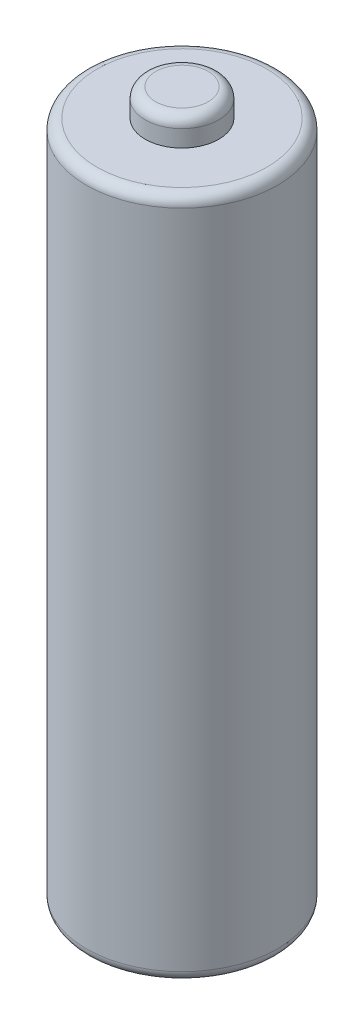
ISO-10303-21;
HEADER;
FILE_DESCRIPTION(('STEP AP214'),'2;1');
FILE_NAME('part.step','',(''),(''),'','','');
FILE_SCHEMA(('AUTOMOTIVE_DESIGN { 1 0 10303 214 1 1 1 1 }'));
ENDSEC;
DATA;
#1=APPLICATION_CONTEXT('core data for automotive mechanical design processes');
#2=APPLICATION_PROTOCOL_DEFINITION('international standard','automotive_design',2000,#1);
#3=PRODUCT_CONTEXT('',#1,'mechanical');
#4=PRODUCT('Part','Part','',(#3));
#5=PRODUCT_RELATED_PRODUCT_CATEGORY('part','',(#4));
#6=PRODUCT_DEFINITION_FORMATION('','',#4);
#7=PRODUCT_DEFINITION_CONTEXT('part definition',#1,'design');
#8=PRODUCT_DEFINITION('design','',#6,#7);
#9=PRODUCT_DEFINITION_SHAPE('','',#8);
#10=(LENGTH_UNIT() NAMED_UNIT(*) SI_UNIT(.MILLI.,.METRE.));
#11=(NAMED_UNIT(*) PLANE_ANGLE_UNIT() SI_UNIT($,.RADIAN.));
#12=(NAMED_UNIT(*) SI_UNIT($,.STERADIAN.) SOLID_ANGLE_UNIT());
#13=UNCERTAINTY_MEASURE_WITH_UNIT(LENGTH_MEASURE(1.E-05),#10,'distance_accuracy_value','');
#14=(GEOMETRIC_REPRESENTATION_CONTEXT(3) GLOBAL_UNCERTAINTY_ASSIGNED_CONTEXT((#13)) GLOBAL_UNIT_ASSIGNED_CONTEXT((#10,
#11,#12)) REPRESENTATION_CONTEXT('',''));
#15=CARTESIAN_POINT('',(0.,0.,0.));
#16=DIRECTION('',(0.,0.,1.));
#17=DIRECTION('',(1.,0.,0.));
#18=AXIS2_PLACEMENT_3D('',#15,#16,#17);
#19=CARTESIAN_POINT('',(0.,65.,0.));
#20=DIRECTION('',(0.,-1.,0.));
#21=DIRECTION('',(0.,0.,-1.));
#22=AXIS2_PLACEMENT_3D('',#19,#20,#21);
#23=CYLINDRICAL_SURFACE('',#22,9.1);
#24=CARTESIAN_POINT('',(0.,1.,0.));
#25=DIRECTION('',(0.,1.,0.));
#26=DIRECTION('',(0.,0.,1.));
#27=AXIS2_PLACEMENT_3D('',#24,#25,#26);
#28=CIRCLE('',#27,9.1);
#29=CARTESIAN_POINT('',(0.,1.,9.1));
#30=VERTEX_POINT('',#29);
#31=EDGE_CURVE('E56',#30,#30,#28,.T.);
#32=ORIENTED_EDGE('',*,*,#31,.T.);
#33=EDGE_LOOP('',(#32));
#34=FACE_BOUND('',#33,.T.);
#35=CARTESIAN_POINT('',(0.,64.,0.));
#36=DIRECTION('',(0.,1.,0.));
#37=DIRECTION('',(0.,0.,1.));
#38=AXIS2_PLACEMENT_3D('',#35,#36,#37);
#39=CIRCLE('',#38,9.1);
#40=CARTESIAN_POINT('',(0.,64.,9.1));
#41=VERTEX_POINT('',#40);
#42=EDGE_CURVE('E61',#41,#41,#39,.F.);
#43=ORIENTED_EDGE('',*,*,#42,.T.);
#44=EDGE_LOOP('',(#43));
#45=FACE_BOUND('',#44,.T.);
#46=ADVANCED_FACE('F43',(#34,#45),#23,.T.);
#47=CARTESIAN_POINT('',(0.,65.,0.));
#48=DIRECTION('',(0.,1.,0.));
#49=DIRECTION('',(0.,0.,1.));
#50=AXIS2_PLACEMENT_3D('',#47,#48,#49);
#51=PLANE('',#50);
#52=CARTESIAN_POINT('',(0.,65.,0.));
#53=DIRECTION('',(0.,1.,0.));
#54=DIRECTION('',(0.,0.,1.));
#55=AXIS2_PLACEMENT_3D('',#52,#53,#54);
#56=CIRCLE('',#55,8.1);
#57=CARTESIAN_POINT('',(0.,65.,8.1));
#58=VERTEX_POINT('',#57);
#59=EDGE_CURVE('E10',#58,#58,#56,.T.);
#60=ORIENTED_EDGE('',*,*,#59,.T.);
#61=EDGE_LOOP('',(#60));
#62=FACE_BOUND('',#61,.T.);
#63=CARTESIAN_POINT('',(0.,65.,0.));
#64=DIRECTION('',(0.,1.,0.));
#65=DIRECTION('',(0.,0.,1.));
#66=AXIS2_PLACEMENT_3D('',#63,#64,#65);
#67=CIRCLE('',#66,3.5);
#68=CARTESIAN_POINT('',(0.,65.,3.5));
#69=VERTEX_POINT('',#68);
#70=EDGE_CURVE('E75',#69,#69,#67,.T.);
#71=ORIENTED_EDGE('',*,*,#70,.F.);
#72=EDGE_LOOP('',(#71));
#73=FACE_BOUND('',#72,.T.);
#74=ADVANCED_FACE('F82',(#62,#73),#51,.T.);
#75=CARTESIAN_POINT('',(0.,0.,0.));
#76=DIRECTION('',(0.,1.,0.));
#77=DIRECTION('',(0.,0.,1.));
#78=AXIS2_PLACEMENT_3D('',#75,#76,#77);
#79=PLANE('',#78);
#80=CARTESIAN_POINT('',(0.,0.,0.));
#81=DIRECTION('',(0.,1.,0.));
#82=DIRECTION('',(0.,0.,1.));
#83=AXIS2_PLACEMENT_3D('',#80,#81,#82);
#84=CIRCLE('',#83,8.1);
#85=CARTESIAN_POINT('',(0.,0.,8.1));
#86=VERTEX_POINT('',#85);
#87=EDGE_CURVE('E51',#86,#86,#84,.F.);
#88=ORIENTED_EDGE('',*,*,#87,.T.);
#89=EDGE_LOOP('',(#88));
#90=FACE_BOUND('',#89,.T.);
#91=ADVANCED_FACE('F84',(#90),#79,.F.);
#92=CARTESIAN_POINT('',(0.,67.6,0.));
#93=DIRECTION('',(0.,-1.,0.));
#94=DIRECTION('',(0.,0.,-1.));
#95=AXIS2_PLACEMENT_3D('',#92,#93,#94);
#96=CYLINDRICAL_SURFACE('',#95,3.5);
#97=CARTESIAN_POINT('',(0.,66.6,0.));
#98=DIRECTION('',(0.,1.,0.));
#99=DIRECTION('',(0.,0.,1.));
#100=AXIS2_PLACEMENT_3D('',#97,#98,#99);
#101=CIRCLE('',#100,3.5);
#102=CARTESIAN_POINT('',(0.,66.6,3.5));
#103=VERTEX_POINT('',#102);
#104=EDGE_CURVE('E67',#103,#103,#101,.F.);
#105=ORIENTED_EDGE('',*,*,#104,.T.);
#106=EDGE_LOOP('',(#105));
#107=FACE_BOUND('',#106,.T.);
#108=ORIENTED_EDGE('',*,*,#70,.T.);
#109=EDGE_LOOP('',(#108));
#110=FACE_BOUND('',#109,.T.);
#111=ADVANCED_FACE('F80',(#107,#110),#96,.T.);
#112=CARTESIAN_POINT('',(0.,67.6,0.));
#113=DIRECTION('',(0.,1.,0.));
#114=DIRECTION('',(0.,0.,1.));
#115=AXIS2_PLACEMENT_3D('',#112,#113,#114);
#116=PLANE('',#115);
#117=CARTESIAN_POINT('',(0.,67.6,0.));
#118=DIRECTION('',(0.,1.,0.));
#119=DIRECTION('',(0.,0.,1.));
#120=AXIS2_PLACEMENT_3D('',#117,#118,#119);
#121=CIRCLE('',#120,2.5);
#122=CARTESIAN_POINT('',(0.,67.6,2.5));
#123=VERTEX_POINT('',#122);
#124=EDGE_CURVE('E71',#123,#123,#121,.T.);
#125=ORIENTED_EDGE('',*,*,#124,.T.);
#126=EDGE_LOOP('',(#125));
#127=FACE_BOUND('',#126,.T.);
#128=ADVANCED_FACE('F99',(#127),#116,.T.);
#129=CARTESIAN_POINT('',(0.,66.6,0.));
#130=DIRECTION('',(0.,1.,0.));
#131=DIRECTION('',(0.,0.,1.));
#132=AXIS2_PLACEMENT_3D('',#129,#130,#131);
#133=TOROIDAL_SURFACE('',#132,2.5,1.);
#134=ORIENTED_EDGE('',*,*,#104,.F.);
#135=EDGE_LOOP('',(#134));
#136=FACE_BOUND('',#135,.T.);
#137=ORIENTED_EDGE('',*,*,#124,.F.);
#138=EDGE_LOOP('',(#137));
#139=FACE_BOUND('',#138,.T.);
#140=ADVANCED_FACE('F96',(#136,#139),#133,.T.);
#141=CARTESIAN_POINT('',(0.,1.,0.));
#142=DIRECTION('',(0.,1.,0.));
#143=DIRECTION('',(0.,0.,1.));
#144=AXIS2_PLACEMENT_3D('',#141,#142,#143);
#145=TOROIDAL_SURFACE('',#144,8.1,1.);
#146=ORIENTED_EDGE('',*,*,#87,.F.);
#147=EDGE_LOOP('',(#146));
#148=FACE_BOUND('',#147,.T.);
#149=ORIENTED_EDGE('',*,*,#31,.F.);
#150=EDGE_LOOP('',(#149));
#151=FACE_BOUND('',#150,.T.);
#152=ADVANCED_FACE('F98',(#148,#151),#145,.T.);
#153=CARTESIAN_POINT('',(0.,64.,0.));
#154=DIRECTION('',(0.,1.,0.));
#155=DIRECTION('',(0.,0.,1.));
#156=AXIS2_PLACEMENT_3D('',#153,#154,#155);
#157=TOROIDAL_SURFACE('',#156,8.1,1.);
#158=ORIENTED_EDGE('',*,*,#42,.F.);
#159=EDGE_LOOP('',(#158));
#160=FACE_BOUND('',#159,.T.);
#161=ORIENTED_EDGE('',*,*,#59,.F.);
#162=EDGE_LOOP('',(#161));
#163=FACE_BOUND('',#162,.T.);
#164=ADVANCED_FACE('F45',(#160,#163),#157,.T.);
#165=CLOSED_SHELL('',(#46,#74,#91,#111,#128,#140,#152,#164));
#166=MANIFOLD_SOLID_BREP('B2',#165);
#167=ADVANCED_BREP_SHAPE_REPRESENTATION('',(#18,#166),#14);
#168=SHAPE_DEFINITION_REPRESENTATION(#9,#167);
ENDSEC;
END-ISO-10303-21;
